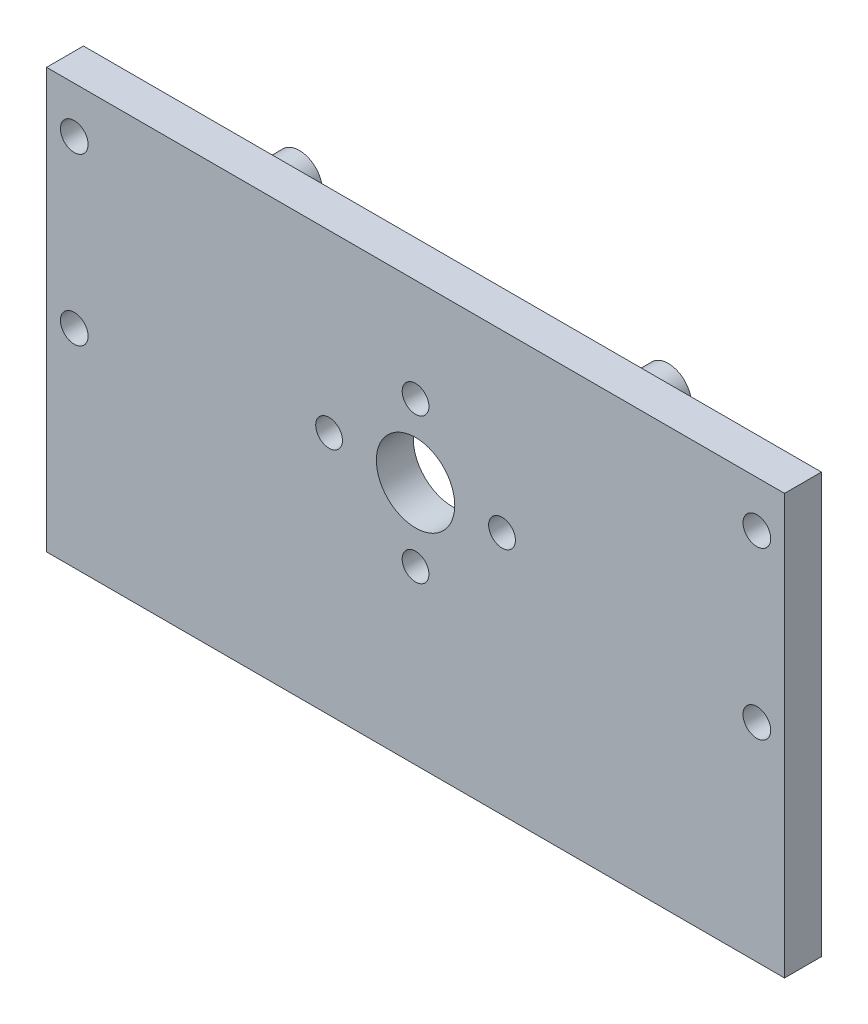
ISO-10303-21;
HEADER;
FILE_DESCRIPTION(('STEP AP214'),'2;1');
FILE_NAME('part.step','',(''),(''),'','','');
FILE_SCHEMA(('AUTOMOTIVE_DESIGN { 1 0 10303 214 1 1 1 1 }'));
ENDSEC;
DATA;
#1=APPLICATION_CONTEXT('core data for automotive mechanical design processes');
#2=APPLICATION_PROTOCOL_DEFINITION('international standard','automotive_design',2000,#1);
#3=PRODUCT_CONTEXT('',#1,'mechanical');
#4=PRODUCT('Part','Part','',(#3));
#5=PRODUCT_RELATED_PRODUCT_CATEGORY('part','',(#4));
#6=PRODUCT_DEFINITION_FORMATION('','',#4);
#7=PRODUCT_DEFINITION_CONTEXT('part definition',#1,'design');
#8=PRODUCT_DEFINITION('design','',#6,#7);
#9=PRODUCT_DEFINITION_SHAPE('','',#8);
#10=(LENGTH_UNIT() NAMED_UNIT(*) SI_UNIT(.MILLI.,.METRE.));
#11=(NAMED_UNIT(*) PLANE_ANGLE_UNIT() SI_UNIT($,.RADIAN.));
#12=(NAMED_UNIT(*) SI_UNIT($,.STERADIAN.) SOLID_ANGLE_UNIT());
#13=UNCERTAINTY_MEASURE_WITH_UNIT(LENGTH_MEASURE(1.E-05),#10,'distance_accuracy_value','');
#14=(GEOMETRIC_REPRESENTATION_CONTEXT(3) GLOBAL_UNCERTAINTY_ASSIGNED_CONTEXT((#13)) GLOBAL_UNIT_ASSIGNED_CONTEXT((#10,
#11,#12)) REPRESENTATION_CONTEXT('',''));
#15=CARTESIAN_POINT('',(0.,0.,0.));
#16=DIRECTION('',(0.,0.,1.));
#17=DIRECTION('',(1.,0.,0.));
#18=AXIS2_PLACEMENT_3D('',#15,#16,#17);
#19=CARTESIAN_POINT('',(40.,0.,-1.));
#20=DIRECTION('',(-1.,0.,0.));
#21=DIRECTION('',(0.,-1.,0.));
#22=AXIS2_PLACEMENT_3D('',#19,#20,#21);
#23=PLANE('',#22);
#24=DIRECTION('',(0.,0.,1.));
#25=VECTOR('',#24,1.);
#26=CARTESIAN_POINT('',(40.,22.75,-1.));
#27=LINE('',#26,#25);
#28=CARTESIAN_POINT('',(40.,22.75,-1.));
#29=VERTEX_POINT('',#28);
#30=CARTESIAN_POINT('',(40.,22.75,3.));
#31=VERTEX_POINT('',#30);
#32=EDGE_CURVE('E220',#29,#31,#27,.T.);
#33=ORIENTED_EDGE('',*,*,#32,.T.);
#34=DIRECTION('',(0.,-1.,0.));
#35=VECTOR('',#34,1.);
#36=CARTESIAN_POINT('',(40.,0.,3.));
#37=LINE('',#36,#35);
#38=CARTESIAN_POINT('',(40.,-22.75,3.));
#39=VERTEX_POINT('',#38);
#40=EDGE_CURVE('E181',#31,#39,#37,.T.);
#41=ORIENTED_EDGE('',*,*,#40,.T.);
#42=DIRECTION('',(0.,0.,1.));
#43=VECTOR('',#42,1.);
#44=CARTESIAN_POINT('',(40.,-22.75,-1.));
#45=LINE('',#44,#43);
#46=CARTESIAN_POINT('',(40.,-22.75,-1.));
#47=VERTEX_POINT('',#46);
#48=EDGE_CURVE('E222',#47,#39,#45,.T.);
#49=ORIENTED_EDGE('',*,*,#48,.F.);
#50=DIRECTION('',(0.,-1.,0.));
#51=VECTOR('',#50,1.);
#52=CARTESIAN_POINT('',(40.,0.,-1.));
#53=LINE('',#52,#51);
#54=EDGE_CURVE('E208',#29,#47,#53,.T.);
#55=ORIENTED_EDGE('',*,*,#54,.F.);
#56=EDGE_LOOP('',(#33,#41,#49,#55));
#57=FACE_BOUND('',#56,.T.);
#58=ADVANCED_FACE('F41',(#57),#23,.F.);
#59=CARTESIAN_POINT('',(0.,-22.75,-1.));
#60=DIRECTION('',(0.,-1.,0.));
#61=DIRECTION('',(0.,0.,-1.));
#62=AXIS2_PLACEMENT_3D('',#59,#60,#61);
#63=PLANE('',#62);
#64=ORIENTED_EDGE('',*,*,#48,.T.);
#65=DIRECTION('',(1.,0.,0.));
#66=VECTOR('',#65,1.);
#67=CARTESIAN_POINT('',(0.,-22.75,3.));
#68=LINE('',#67,#66);
#69=CARTESIAN_POINT('',(-40.,-22.75,3.));
#70=VERTEX_POINT('',#69);
#71=EDGE_CURVE('E190',#70,#39,#68,.T.);
#72=ORIENTED_EDGE('',*,*,#71,.F.);
#73=DIRECTION('',(0.,0.,1.));
#74=VECTOR('',#73,1.);
#75=CARTESIAN_POINT('',(-40.,-22.75,-1.));
#76=LINE('',#75,#74);
#77=CARTESIAN_POINT('',(-40.,-22.75,-1.));
#78=VERTEX_POINT('',#77);
#79=EDGE_CURVE('E225',#78,#70,#76,.T.);
#80=ORIENTED_EDGE('',*,*,#79,.F.);
#81=DIRECTION('',(1.,0.,0.));
#82=VECTOR('',#81,1.);
#83=CARTESIAN_POINT('',(0.,-22.75,-1.));
#84=LINE('',#83,#82);
#85=CARTESIAN_POINT('',(-20.,-22.75,-1.));
#86=VERTEX_POINT('',#85);
#87=EDGE_CURVE('E217',#78,#86,#84,.T.);
#88=ORIENTED_EDGE('',*,*,#87,.T.);
#89=CARTESIAN_POINT('',(20.,-22.75,-1.));
#90=VERTEX_POINT('',#89);
#91=EDGE_CURVE('E221',#86,#90,#84,.T.);
#92=ORIENTED_EDGE('',*,*,#91,.T.);
#93=EDGE_CURVE('E216',#90,#47,#84,.T.);
#94=ORIENTED_EDGE('',*,*,#93,.T.);
#95=EDGE_LOOP('',(#64,#72,#80,#88,#92,#94));
#96=FACE_BOUND('',#95,.T.);
#97=ADVANCED_FACE('F319',(#96),#63,.T.);
#98=CARTESIAN_POINT('',(-40.,0.,-1.));
#99=DIRECTION('',(-1.,0.,0.));
#100=DIRECTION('',(0.,0.,1.));
#101=AXIS2_PLACEMENT_3D('',#98,#99,#100);
#102=PLANE('',#101);
#103=ORIENTED_EDGE('',*,*,#79,.T.);
#104=DIRECTION('',(0.,-1.,0.));
#105=VECTOR('',#104,1.);
#106=CARTESIAN_POINT('',(-40.,0.,3.));
#107=LINE('',#106,#105);
#108=CARTESIAN_POINT('',(-40.,22.75,3.));
#109=VERTEX_POINT('',#108);
#110=EDGE_CURVE('E187',#109,#70,#107,.T.);
#111=ORIENTED_EDGE('',*,*,#110,.F.);
#112=DIRECTION('',(0.,0.,1.));
#113=VECTOR('',#112,1.);
#114=CARTESIAN_POINT('',(-40.,22.75,-1.));
#115=LINE('',#114,#113);
#116=CARTESIAN_POINT('',(-40.,22.75,-1.));
#117=VERTEX_POINT('',#116);
#118=EDGE_CURVE('E227',#117,#109,#115,.T.);
#119=ORIENTED_EDGE('',*,*,#118,.F.);
#120=DIRECTION('',(0.,-1.,0.));
#121=VECTOR('',#120,1.);
#122=CARTESIAN_POINT('',(-40.,0.,-1.));
#123=LINE('',#122,#121);
#124=EDGE_CURVE('E213',#117,#78,#123,.T.);
#125=ORIENTED_EDGE('',*,*,#124,.T.);
#126=EDGE_LOOP('',(#103,#111,#119,#125));
#127=FACE_BOUND('',#126,.T.);
#128=ADVANCED_FACE('F325',(#127),#102,.T.);
#129=CARTESIAN_POINT('',(0.,3.75,-1.));
#130=DIRECTION('',(0.,0.,1.));
#131=DIRECTION('',(1.,0.,0.));
#132=AXIS2_PLACEMENT_3D('',#129,#130,#131);
#133=CYLINDRICAL_SURFACE('',#132,4.25);
#134=CARTESIAN_POINT('',(0.,3.75,-1.));
#135=DIRECTION('',(0.,0.,1.));
#136=DIRECTION('',(1.,0.,0.));
#137=AXIS2_PLACEMENT_3D('',#134,#135,#136);
#138=CIRCLE('',#137,4.25);
#139=CARTESIAN_POINT('',(4.25,3.75,-1.));
#140=VERTEX_POINT('',#139);
#141=EDGE_CURVE('E205',#140,#140,#138,.T.);
#142=ORIENTED_EDGE('',*,*,#141,.F.);
#143=EDGE_LOOP('',(#142));
#144=FACE_BOUND('',#143,.T.);
#145=CARTESIAN_POINT('',(0.,3.75,3.));
#146=DIRECTION('',(0.,0.,1.));
#147=DIRECTION('',(1.,0.,0.));
#148=AXIS2_PLACEMENT_3D('',#145,#146,#147);
#149=CIRCLE('',#148,4.25);
#150=CARTESIAN_POINT('',(4.25,3.75,3.));
#151=VERTEX_POINT('',#150);
#152=EDGE_CURVE('E178',#151,#151,#149,.T.);
#153=ORIENTED_EDGE('',*,*,#152,.T.);
#154=EDGE_LOOP('',(#153));
#155=FACE_BOUND('',#154,.T.);
#156=ADVANCED_FACE('F357',(#144,#155),#133,.F.);
#157=CARTESIAN_POINT('',(37.,17.75,-1.));
#158=DIRECTION('',(0.,0.,1.));
#159=DIRECTION('',(1.,0.,0.));
#160=AXIS2_PLACEMENT_3D('',#157,#158,#159);
#161=CYLINDRICAL_SURFACE('',#160,1.5);
#162=CARTESIAN_POINT('',(37.,17.75,-1.));
#163=DIRECTION('',(0.,0.,1.));
#164=DIRECTION('',(1.,0.,0.));
#165=AXIS2_PLACEMENT_3D('',#162,#163,#164);
#166=CIRCLE('',#165,1.5);
#167=CARTESIAN_POINT('',(38.5,17.75,-1.));
#168=VERTEX_POINT('',#167);
#169=EDGE_CURVE('E202',#168,#168,#166,.T.);
#170=ORIENTED_EDGE('',*,*,#169,.F.);
#171=EDGE_LOOP('',(#170));
#172=FACE_BOUND('',#171,.T.);
#173=CARTESIAN_POINT('',(37.,17.75,3.));
#174=DIRECTION('',(0.,0.,1.));
#175=DIRECTION('',(1.,0.,0.));
#176=AXIS2_PLACEMENT_3D('',#173,#174,#175);
#177=CIRCLE('',#176,1.5);
#178=CARTESIAN_POINT('',(38.5,17.75,3.));
#179=VERTEX_POINT('',#178);
#180=EDGE_CURVE('E175',#179,#179,#177,.T.);
#181=ORIENTED_EDGE('',*,*,#180,.T.);
#182=EDGE_LOOP('',(#181));
#183=FACE_BOUND('',#182,.T.);
#184=ADVANCED_FACE('F360',(#172,#183),#161,.F.);
#185=CARTESIAN_POINT('',(37.,-0.25,-1.));
#186=DIRECTION('',(0.,0.,1.));
#187=DIRECTION('',(1.,0.,0.));
#188=AXIS2_PLACEMENT_3D('',#185,#186,#187);
#189=CYLINDRICAL_SURFACE('',#188,1.5);
#190=CARTESIAN_POINT('',(37.,-0.25,-1.));
#191=DIRECTION('',(0.,0.,1.));
#192=DIRECTION('',(1.,0.,0.));
#193=AXIS2_PLACEMENT_3D('',#190,#191,#192);
#194=CIRCLE('',#193,1.5);
#195=CARTESIAN_POINT('',(38.5,-0.25,-1.));
#196=VERTEX_POINT('',#195);
#197=EDGE_CURVE('E199',#196,#196,#194,.T.);
#198=ORIENTED_EDGE('',*,*,#197,.F.);
#199=EDGE_LOOP('',(#198));
#200=FACE_BOUND('',#199,.T.);
#201=CARTESIAN_POINT('',(37.,-0.25,3.));
#202=DIRECTION('',(0.,0.,1.));
#203=DIRECTION('',(1.,0.,0.));
#204=AXIS2_PLACEMENT_3D('',#201,#202,#203);
#205=CIRCLE('',#204,1.5);
#206=CARTESIAN_POINT('',(38.5,-0.25,3.));
#207=VERTEX_POINT('',#206);
#208=EDGE_CURVE('E172',#207,#207,#205,.T.);
#209=ORIENTED_EDGE('',*,*,#208,.T.);
#210=EDGE_LOOP('',(#209));
#211=FACE_BOUND('',#210,.T.);
#212=ADVANCED_FACE('F364',(#200,#211),#189,.F.);
#213=CARTESIAN_POINT('',(-37.,-0.25,-1.));
#214=DIRECTION('',(0.,0.,1.));
#215=DIRECTION('',(1.,0.,0.));
#216=AXIS2_PLACEMENT_3D('',#213,#214,#215);
#217=CYLINDRICAL_SURFACE('',#216,1.5);
#218=CARTESIAN_POINT('',(-37.,-0.25,-1.));
#219=DIRECTION('',(0.,0.,1.));
#220=DIRECTION('',(1.,0.,0.));
#221=AXIS2_PLACEMENT_3D('',#218,#219,#220);
#222=CIRCLE('',#221,1.5);
#223=CARTESIAN_POINT('',(-35.5,-0.25,-1.));
#224=VERTEX_POINT('',#223);
#225=EDGE_CURVE('E196',#224,#224,#222,.T.);
#226=ORIENTED_EDGE('',*,*,#225,.F.);
#227=EDGE_LOOP('',(#226));
#228=FACE_BOUND('',#227,.T.);
#229=CARTESIAN_POINT('',(-37.,-0.25,3.));
#230=DIRECTION('',(0.,0.,1.));
#231=DIRECTION('',(1.,0.,0.));
#232=AXIS2_PLACEMENT_3D('',#229,#230,#231);
#233=CIRCLE('',#232,1.5);
#234=CARTESIAN_POINT('',(-35.5,-0.25,3.));
#235=VERTEX_POINT('',#234);
#236=EDGE_CURVE('E169',#235,#235,#233,.T.);
#237=ORIENTED_EDGE('',*,*,#236,.T.);
#238=EDGE_LOOP('',(#237));
#239=FACE_BOUND('',#238,.T.);
#240=ADVANCED_FACE('F368',(#228,#239),#217,.F.);
#241=CARTESIAN_POINT('',(-37.,17.75,-1.));
#242=DIRECTION('',(0.,0.,1.));
#243=DIRECTION('',(1.,0.,0.));
#244=AXIS2_PLACEMENT_3D('',#241,#242,#243);
#245=CYLINDRICAL_SURFACE('',#244,1.5);
#246=CARTESIAN_POINT('',(-37.,17.75,-1.));
#247=DIRECTION('',(0.,0.,1.));
#248=DIRECTION('',(1.,0.,0.));
#249=AXIS2_PLACEMENT_3D('',#246,#247,#248);
#250=CIRCLE('',#249,1.5);
#251=CARTESIAN_POINT('',(-35.5,17.75,-1.));
#252=VERTEX_POINT('',#251);
#253=EDGE_CURVE('E193',#252,#252,#250,.T.);
#254=ORIENTED_EDGE('',*,*,#253,.F.);
#255=EDGE_LOOP('',(#254));
#256=FACE_BOUND('',#255,.T.);
#257=CARTESIAN_POINT('',(-37.,17.75,3.));
#258=DIRECTION('',(0.,0.,1.));
#259=DIRECTION('',(1.,0.,0.));
#260=AXIS2_PLACEMENT_3D('',#257,#258,#259);
#261=CIRCLE('',#260,1.5);
#262=CARTESIAN_POINT('',(-35.5,17.75,3.));
#263=VERTEX_POINT('',#262);
#264=EDGE_CURVE('E166',#263,#263,#261,.T.);
#265=ORIENTED_EDGE('',*,*,#264,.T.);
#266=EDGE_LOOP('',(#265));
#267=FACE_BOUND('',#266,.T.);
#268=ADVANCED_FACE('F372',(#256,#267),#245,.F.);
#269=CARTESIAN_POINT('',(0.,22.75,-1.));
#270=DIRECTION('',(0.,-1.,0.));
#271=DIRECTION('',(0.,0.,-1.));
#272=AXIS2_PLACEMENT_3D('',#269,#270,#271);
#273=PLANE('',#272);
#274=ORIENTED_EDGE('',*,*,#118,.T.);
#275=DIRECTION('',(1.,0.,0.));
#276=VECTOR('',#275,1.);
#277=CARTESIAN_POINT('',(0.,22.75,3.));
#278=LINE('',#277,#276);
#279=EDGE_CURVE('E184',#109,#31,#278,.T.);
#280=ORIENTED_EDGE('',*,*,#279,.T.);
#281=ORIENTED_EDGE('',*,*,#32,.F.);
#282=DIRECTION('',(1.,0.,0.));
#283=VECTOR('',#282,1.);
#284=CARTESIAN_POINT('',(0.,22.75,-1.));
#285=LINE('',#284,#283);
#286=EDGE_CURVE('E211',#117,#29,#285,.T.);
#287=ORIENTED_EDGE('',*,*,#286,.F.);
#288=EDGE_LOOP('',(#274,#280,#281,#287));
#289=FACE_BOUND('',#288,.T.);
#290=ADVANCED_FACE('F278',(#289),#273,.F.);
#291=CARTESIAN_POINT('',(0.,0.,-1.));
#292=DIRECTION('',(0.,0.,1.));
#293=DIRECTION('',(1.,0.,0.));
#294=AXIS2_PLACEMENT_3D('',#291,#292,#293);
#295=PLANE('',#294);
#296=CARTESIAN_POINT('',(-20.,18.75,-1.));
#297=DIRECTION('',(0.,0.,1.));
#298=DIRECTION('',(1.,0.,0.));
#299=AXIS2_PLACEMENT_3D('',#296,#297,#298);
#300=CIRCLE('',#299,3.5);
#301=CARTESIAN_POINT('',(-16.5,18.75,-1.));
#302=VERTEX_POINT('',#301);
#303=EDGE_CURVE('E252',#302,#302,#300,.T.);
#304=ORIENTED_EDGE('',*,*,#303,.T.);
#305=EDGE_LOOP('',(#304));
#306=FACE_BOUND('',#305,.T.);
#307=CARTESIAN_POINT('',(20.,18.75,-1.));
#308=DIRECTION('',(0.,0.,1.));
#309=DIRECTION('',(1.,0.,0.));
#310=AXIS2_PLACEMENT_3D('',#307,#308,#309);
#311=CIRCLE('',#310,3.5);
#312=CARTESIAN_POINT('',(23.5,18.75,-1.));
#313=VERTEX_POINT('',#312);
#314=EDGE_CURVE('E249',#313,#313,#311,.T.);
#315=ORIENTED_EDGE('',*,*,#314,.T.);
#316=EDGE_LOOP('',(#315));
#317=FACE_BOUND('',#316,.T.);
#318=CARTESIAN_POINT('',(0.,-4.125,-1.));
#319=DIRECTION('',(0.,0.,-1.));
#320=DIRECTION('',(-1.,0.,0.));
#321=AXIS2_PLACEMENT_3D('',#318,#319,#320);
#322=CIRCLE('',#321,1.45);
#323=CARTESIAN_POINT('',(-1.45,-4.125,-1.));
#324=VERTEX_POINT('',#323);
#325=EDGE_CURVE('E287',#324,#324,#322,.T.);
#326=ORIENTED_EDGE('',*,*,#325,.F.);
#327=EDGE_LOOP('',(#326));
#328=FACE_BOUND('',#327,.T.);
#329=CARTESIAN_POINT('',(9.375,3.75,-1.));
#330=DIRECTION('',(0.,0.,-1.));
#331=DIRECTION('',(-1.,0.,0.));
#332=AXIS2_PLACEMENT_3D('',#329,#330,#331);
#333=CIRCLE('',#332,1.45);
#334=CARTESIAN_POINT('',(7.925,3.75,-1.));
#335=VERTEX_POINT('',#334);
#336=EDGE_CURVE('E291',#335,#335,#333,.T.);
#337=ORIENTED_EDGE('',*,*,#336,.F.);
#338=EDGE_LOOP('',(#337));
#339=FACE_BOUND('',#338,.T.);
#340=CARTESIAN_POINT('',(0.,11.625,-1.));
#341=DIRECTION('',(0.,0.,-1.));
#342=DIRECTION('',(-1.,0.,0.));
#343=AXIS2_PLACEMENT_3D('',#340,#341,#342);
#344=CIRCLE('',#343,1.45);
#345=CARTESIAN_POINT('',(-1.45,11.625,-1.));
#346=VERTEX_POINT('',#345);
#347=EDGE_CURVE('E295',#346,#346,#344,.T.);
#348=ORIENTED_EDGE('',*,*,#347,.F.);
#349=EDGE_LOOP('',(#348));
#350=FACE_BOUND('',#349,.T.);
#351=CARTESIAN_POINT('',(-9.375,3.75,-1.));
#352=DIRECTION('',(0.,0.,-1.));
#353=DIRECTION('',(-1.,0.,0.));
#354=AXIS2_PLACEMENT_3D('',#351,#352,#353);
#355=CIRCLE('',#354,1.45);
#356=CARTESIAN_POINT('',(-10.825,3.75,-1.));
#357=VERTEX_POINT('',#356);
#358=EDGE_CURVE('E299',#357,#357,#355,.T.);
#359=ORIENTED_EDGE('',*,*,#358,.F.);
#360=EDGE_LOOP('',(#359));
#361=FACE_BOUND('',#360,.T.);
#362=DIRECTION('',(0.,-1.,0.));
#363=VECTOR('',#362,1.);
#364=CARTESIAN_POINT('',(18.5940650356822,0.,-1.));
#365=LINE('',#364,#363);
#366=CARTESIAN_POINT('',(18.5940650356822,-7.69525703388013,-1.));
#367=VERTEX_POINT('',#366);
#368=CARTESIAN_POINT('',(18.5940650356822,-11.6952570338801,-1.));
#369=VERTEX_POINT('',#368);
#370=EDGE_CURVE('E242',#367,#369,#365,.T.);
#371=ORIENTED_EDGE('',*,*,#370,.F.);
#372=DIRECTION('',(-1.,0.,0.));
#373=VECTOR('',#372,1.);
#374=CARTESIAN_POINT('',(0.,-7.69525703388013,-1.));
#375=LINE('',#374,#373);
#376=CARTESIAN_POINT('',(-18.6059349643178,-7.69525703388013,-1.));
#377=VERTEX_POINT('',#376);
#378=EDGE_CURVE('E244',#367,#377,#375,.T.);
#379=ORIENTED_EDGE('',*,*,#378,.T.);
#380=DIRECTION('',(0.,-1.,0.));
#381=VECTOR('',#380,1.);
#382=CARTESIAN_POINT('',(-18.6059349643178,0.,-1.));
#383=LINE('',#382,#381);
#384=CARTESIAN_POINT('',(-18.6059349643178,-11.6952570338801,-1.));
#385=VERTEX_POINT('',#384);
#386=EDGE_CURVE('E115',#377,#385,#383,.T.);
#387=ORIENTED_EDGE('',*,*,#386,.T.);
#388=DIRECTION('',(-1.,0.,0.));
#389=VECTOR('',#388,1.);
#390=CARTESIAN_POINT('',(0.,-11.6952570338801,-1.));
#391=LINE('',#390,#389);
#392=EDGE_CURVE('E239',#369,#385,#391,.T.);
#393=ORIENTED_EDGE('',*,*,#392,.F.);
#394=EDGE_LOOP('',(#371,#379,#387,#393));
#395=FACE_BOUND('',#394,.T.);
#396=ORIENTED_EDGE('',*,*,#253,.T.);
#397=EDGE_LOOP('',(#396));
#398=FACE_BOUND('',#397,.T.);
#399=ORIENTED_EDGE('',*,*,#225,.T.);
#400=EDGE_LOOP('',(#399));
#401=FACE_BOUND('',#400,.T.);
#402=ORIENTED_EDGE('',*,*,#197,.T.);
#403=EDGE_LOOP('',(#402));
#404=FACE_BOUND('',#403,.T.);
#405=ORIENTED_EDGE('',*,*,#169,.T.);
#406=EDGE_LOOP('',(#405));
#407=FACE_BOUND('',#406,.T.);
#408=ORIENTED_EDGE('',*,*,#141,.T.);
#409=EDGE_LOOP('',(#408));
#410=FACE_BOUND('',#409,.T.);
#411=ORIENTED_EDGE('',*,*,#93,.F.);
#412=CARTESIAN_POINT('',(20.,-19.25,-1.));
#413=DIRECTION('',(0.,0.,1.));
#414=DIRECTION('',(1.,0.,0.));
#415=AXIS2_PLACEMENT_3D('',#412,#413,#414);
#416=CIRCLE('',#415,3.5);
#417=EDGE_CURVE('E54',#90,#90,#416,.T.);
#418=ORIENTED_EDGE('',*,*,#417,.T.);
#419=ORIENTED_EDGE('',*,*,#91,.F.);
#420=CARTESIAN_POINT('',(-20.,-19.25,-1.));
#421=DIRECTION('',(0.,0.,1.));
#422=DIRECTION('',(1.,0.,0.));
#423=AXIS2_PLACEMENT_3D('',#420,#421,#422);
#424=CIRCLE('',#423,3.5);
#425=EDGE_CURVE('E59',#86,#86,#424,.T.);
#426=ORIENTED_EDGE('',*,*,#425,.T.);
#427=ORIENTED_EDGE('',*,*,#87,.F.);
#428=ORIENTED_EDGE('',*,*,#124,.F.);
#429=ORIENTED_EDGE('',*,*,#286,.T.);
#430=ORIENTED_EDGE('',*,*,#54,.T.);
#431=EDGE_LOOP('',(#411,#418,#419,#426,#427,#428,#429,#430));
#432=FACE_BOUND('',#431,.T.);
#433=ADVANCED_FACE('F274',(#306,#317,#328,#339,#350,#361,#395,#398,#401,#404,#407,#410,#432),
#295,.F.);
#434=CARTESIAN_POINT('',(0.,0.,3.));
#435=DIRECTION('',(0.,0.,1.));
#436=DIRECTION('',(1.,0.,0.));
#437=AXIS2_PLACEMENT_3D('',#434,#435,#436);
#438=PLANE('',#437);
#439=CARTESIAN_POINT('',(0.,-4.125,3.));
#440=DIRECTION('',(0.,0.,-1.));
#441=DIRECTION('',(-1.,0.,0.));
#442=AXIS2_PLACEMENT_3D('',#439,#440,#441);
#443=CIRCLE('',#442,1.45);
#444=CARTESIAN_POINT('',(-1.45,-4.125,3.));
#445=VERTEX_POINT('',#444);
#446=EDGE_CURVE('E718',#445,#445,#443,.T.);
#447=ORIENTED_EDGE('',*,*,#446,.T.);
#448=EDGE_LOOP('',(#447));
#449=FACE_BOUND('',#448,.T.);
#450=CARTESIAN_POINT('',(9.375,3.75,3.));
#451=DIRECTION('',(0.,0.,-1.));
#452=DIRECTION('',(-1.,0.,0.));
#453=AXIS2_PLACEMENT_3D('',#450,#451,#452);
#454=CIRCLE('',#453,1.45);
#455=CARTESIAN_POINT('',(7.925,3.75,3.));
#456=VERTEX_POINT('',#455);
#457=EDGE_CURVE('E729',#456,#456,#454,.T.);
#458=ORIENTED_EDGE('',*,*,#457,.T.);
#459=EDGE_LOOP('',(#458));
#460=FACE_BOUND('',#459,.T.);
#461=CARTESIAN_POINT('',(0.,11.625,3.));
#462=DIRECTION('',(0.,0.,-1.));
#463=DIRECTION('',(-1.,0.,0.));
#464=AXIS2_PLACEMENT_3D('',#461,#462,#463);
#465=CIRCLE('',#464,1.45);
#466=CARTESIAN_POINT('',(-1.45,11.625,3.));
#467=VERTEX_POINT('',#466);
#468=EDGE_CURVE('E725',#467,#467,#465,.T.);
#469=ORIENTED_EDGE('',*,*,#468,.T.);
#470=EDGE_LOOP('',(#469));
#471=FACE_BOUND('',#470,.T.);
#472=CARTESIAN_POINT('',(-9.375,3.75,3.));
#473=DIRECTION('',(0.,0.,-1.));
#474=DIRECTION('',(-1.,0.,0.));
#475=AXIS2_PLACEMENT_3D('',#472,#473,#474);
#476=CIRCLE('',#475,1.45);
#477=CARTESIAN_POINT('',(-10.825,3.75,3.));
#478=VERTEX_POINT('',#477);
#479=EDGE_CURVE('E721',#478,#478,#476,.T.);
#480=ORIENTED_EDGE('',*,*,#479,.T.);
#481=EDGE_LOOP('',(#480));
#482=FACE_BOUND('',#481,.T.);
#483=ORIENTED_EDGE('',*,*,#264,.F.);
#484=EDGE_LOOP('',(#483));
#485=FACE_BOUND('',#484,.T.);
#486=ORIENTED_EDGE('',*,*,#236,.F.);
#487=EDGE_LOOP('',(#486));
#488=FACE_BOUND('',#487,.T.);
#489=ORIENTED_EDGE('',*,*,#208,.F.);
#490=EDGE_LOOP('',(#489));
#491=FACE_BOUND('',#490,.T.);
#492=ORIENTED_EDGE('',*,*,#180,.F.);
#493=EDGE_LOOP('',(#492));
#494=FACE_BOUND('',#493,.T.);
#495=ORIENTED_EDGE('',*,*,#152,.F.);
#496=EDGE_LOOP('',(#495));
#497=FACE_BOUND('',#496,.T.);
#498=ORIENTED_EDGE('',*,*,#40,.F.);
#499=ORIENTED_EDGE('',*,*,#279,.F.);
#500=ORIENTED_EDGE('',*,*,#110,.T.);
#501=ORIENTED_EDGE('',*,*,#71,.T.);
#502=EDGE_LOOP('',(#498,#499,#500,#501));
#503=FACE_BOUND('',#502,.T.);
#504=ADVANCED_FACE('F277',(#449,#460,#471,#482,#485,#488,#491,#494,#497,#503),#438,.T.);
#505=CARTESIAN_POINT('',(20.,18.75,-4.4));
#506=DIRECTION('',(0.,0.,1.));
#507=DIRECTION('',(1.,0.,0.));
#508=AXIS2_PLACEMENT_3D('',#505,#506,#507);
#509=CYLINDRICAL_SURFACE('',#508,1.4);
#510=CARTESIAN_POINT('',(20.,18.75,-4.4));
#511=DIRECTION('',(0.,0.,1.));
#512=DIRECTION('',(1.,0.,0.));
#513=AXIS2_PLACEMENT_3D('',#510,#511,#512);
#514=CIRCLE('',#513,1.4);
#515=CARTESIAN_POINT('',(21.4,18.75,-4.4));
#516=VERTEX_POINT('',#515);
#517=EDGE_CURVE('E160',#516,#516,#514,.T.);
#518=ORIENTED_EDGE('',*,*,#517,.F.);
#519=EDGE_LOOP('',(#518));
#520=FACE_BOUND('',#519,.T.);
#521=CARTESIAN_POINT('',(20.,18.75,-1.));
#522=DIRECTION('',(0.,0.,1.));
#523=DIRECTION('',(1.,0.,0.));
#524=AXIS2_PLACEMENT_3D('',#521,#522,#523);
#525=CIRCLE('',#524,1.4);
#526=CARTESIAN_POINT('',(21.4,18.75,-1.));
#527=VERTEX_POINT('',#526);
#528=EDGE_CURVE('E224',#527,#527,#525,.T.);
#529=ORIENTED_EDGE('',*,*,#528,.T.);
#530=EDGE_LOOP('',(#529));
#531=FACE_BOUND('',#530,.T.);
#532=ADVANCED_FACE('F334',(#520,#531),#509,.F.);
#533=CARTESIAN_POINT('',(20.,18.75,-4.4));
#534=DIRECTION('',(0.,0.,1.));
#535=DIRECTION('',(1.,0.,0.));
#536=AXIS2_PLACEMENT_3D('',#533,#534,#535);
#537=CYLINDRICAL_SURFACE('',#536,2.5);
#538=CARTESIAN_POINT('',(20.,18.75,-2.));
#539=DIRECTION('',(0.,0.,1.));
#540=DIRECTION('',(1.,0.,0.));
#541=AXIS2_PLACEMENT_3D('',#538,#539,#540);
#542=CIRCLE('',#541,2.5);
#543=CARTESIAN_POINT('',(22.5,18.75,-2.));
#544=VERTEX_POINT('',#543);
#545=EDGE_CURVE('E11',#544,#544,#542,.F.);
#546=ORIENTED_EDGE('',*,*,#545,.T.);
#547=EDGE_LOOP('',(#546));
#548=FACE_BOUND('',#547,.T.);
#549=CARTESIAN_POINT('',(20.,18.75,-4.4));
#550=DIRECTION('',(0.,0.,1.));
#551=DIRECTION('',(1.,0.,0.));
#552=AXIS2_PLACEMENT_3D('',#549,#550,#551);
#553=CIRCLE('',#552,2.5);
#554=CARTESIAN_POINT('',(22.5,18.75,-4.4));
#555=VERTEX_POINT('',#554);
#556=EDGE_CURVE('E163',#555,#555,#553,.T.);
#557=ORIENTED_EDGE('',*,*,#556,.T.);
#558=EDGE_LOOP('',(#557));
#559=FACE_BOUND('',#558,.T.);
#560=ADVANCED_FACE('F342',(#548,#559),#537,.T.);
#561=CARTESIAN_POINT('',(0.,0.,-4.4));
#562=DIRECTION('',(0.,0.,1.));
#563=DIRECTION('',(1.,0.,0.));
#564=AXIS2_PLACEMENT_3D('',#561,#562,#563);
#565=PLANE('',#564);
#566=ORIENTED_EDGE('',*,*,#517,.T.);
#567=EDGE_LOOP('',(#566));
#568=FACE_BOUND('',#567,.T.);
#569=ORIENTED_EDGE('',*,*,#556,.F.);
#570=EDGE_LOOP('',(#569));
#571=FACE_BOUND('',#570,.T.);
#572=ADVANCED_FACE('F421',(#568,#571),#565,.F.);
#573=ORIENTED_EDGE('',*,*,#528,.F.);
#574=EDGE_LOOP('',(#573));
#575=FACE_BOUND('',#574,.T.);
#576=ADVANCED_FACE('F281',(#575),#295,.F.);
#577=CARTESIAN_POINT('',(-20.,18.75,-4.4));
#578=DIRECTION('',(0.,0.,1.));
#579=DIRECTION('',(1.,0.,0.));
#580=AXIS2_PLACEMENT_3D('',#577,#578,#579);
#581=CYLINDRICAL_SURFACE('',#580,1.4);
#582=CARTESIAN_POINT('',(-20.,18.75,-4.4));
#583=DIRECTION('',(0.,0.,1.));
#584=DIRECTION('',(1.,0.,0.));
#585=AXIS2_PLACEMENT_3D('',#582,#583,#584);
#586=CIRCLE('',#585,1.4);
#587=CARTESIAN_POINT('',(-18.6,18.75,-4.4));
#588=VERTEX_POINT('',#587);
#589=EDGE_CURVE('E154',#588,#588,#586,.T.);
#590=ORIENTED_EDGE('',*,*,#589,.F.);
#591=EDGE_LOOP('',(#590));
#592=FACE_BOUND('',#591,.T.);
#593=CARTESIAN_POINT('',(-20.,18.75,-1.));
#594=DIRECTION('',(0.,0.,1.));
#595=DIRECTION('',(1.,0.,0.));
#596=AXIS2_PLACEMENT_3D('',#593,#594,#595);
#597=CIRCLE('',#596,1.4);
#598=CARTESIAN_POINT('',(-18.6,18.75,-1.));
#599=VERTEX_POINT('',#598);
#600=EDGE_CURVE('E232',#599,#599,#597,.T.);
#601=ORIENTED_EDGE('',*,*,#600,.T.);
#602=EDGE_LOOP('',(#601));
#603=FACE_BOUND('',#602,.T.);
#604=ADVANCED_FACE('F417',(#592,#603),#581,.F.);
#605=CARTESIAN_POINT('',(-20.,18.75,-4.4));
#606=DIRECTION('',(0.,0.,1.));
#607=DIRECTION('',(1.,0.,0.));
#608=AXIS2_PLACEMENT_3D('',#605,#606,#607);
#609=CYLINDRICAL_SURFACE('',#608,2.5);
#610=CARTESIAN_POINT('',(-20.,18.75,-2.));
#611=DIRECTION('',(0.,0.,1.));
#612=DIRECTION('',(1.,0.,0.));
#613=AXIS2_PLACEMENT_3D('',#610,#611,#612);
#614=CIRCLE('',#613,2.5);
#615=CARTESIAN_POINT('',(-17.5,18.75,-2.));
#616=VERTEX_POINT('',#615);
#617=EDGE_CURVE('E49',#616,#616,#614,.F.);
#618=ORIENTED_EDGE('',*,*,#617,.T.);
#619=EDGE_LOOP('',(#618));
#620=FACE_BOUND('',#619,.T.);
#621=CARTESIAN_POINT('',(-20.,18.75,-4.4));
#622=DIRECTION('',(0.,0.,1.));
#623=DIRECTION('',(1.,0.,0.));
#624=AXIS2_PLACEMENT_3D('',#621,#622,#623);
#625=CIRCLE('',#624,2.5);
#626=CARTESIAN_POINT('',(-17.5,18.75,-4.4));
#627=VERTEX_POINT('',#626);
#628=EDGE_CURVE('E157',#627,#627,#625,.T.);
#629=ORIENTED_EDGE('',*,*,#628,.T.);
#630=EDGE_LOOP('',(#629));
#631=FACE_BOUND('',#630,.T.);
#632=ADVANCED_FACE('F265',(#620,#631),#609,.T.);
#633=CARTESIAN_POINT('',(0.,0.,-4.4));
#634=DIRECTION('',(0.,0.,1.));
#635=DIRECTION('',(1.,0.,0.));
#636=AXIS2_PLACEMENT_3D('',#633,#634,#635);
#637=PLANE('',#636);
#638=ORIENTED_EDGE('',*,*,#589,.T.);
#639=EDGE_LOOP('',(#638));
#640=FACE_BOUND('',#639,.T.);
#641=ORIENTED_EDGE('',*,*,#628,.F.);
#642=EDGE_LOOP('',(#641));
#643=FACE_BOUND('',#642,.T.);
#644=ADVANCED_FACE('F411',(#640,#643),#637,.F.);
#645=ORIENTED_EDGE('',*,*,#600,.F.);
#646=EDGE_LOOP('',(#645));
#647=FACE_BOUND('',#646,.T.);
#648=ADVANCED_FACE('F405',(#647),#295,.F.);
#649=CARTESIAN_POINT('',(-20.,-19.25,-4.4));
#650=DIRECTION('',(0.,0.,1.));
#651=DIRECTION('',(1.,0.,0.));
#652=AXIS2_PLACEMENT_3D('',#649,#650,#651);
#653=CYLINDRICAL_SURFACE('',#652,1.4);
#654=CARTESIAN_POINT('',(-20.,-19.25,-4.4));
#655=DIRECTION('',(0.,0.,1.));
#656=DIRECTION('',(1.,0.,0.));
#657=AXIS2_PLACEMENT_3D('',#654,#655,#656);
#658=CIRCLE('',#657,1.4);
#659=CARTESIAN_POINT('',(-18.6,-19.25,-4.4));
#660=VERTEX_POINT('',#659);
#661=EDGE_CURVE('E144',#660,#660,#658,.T.);
#662=ORIENTED_EDGE('',*,*,#661,.F.);
#663=EDGE_LOOP('',(#662));
#664=FACE_BOUND('',#663,.T.);
#665=CARTESIAN_POINT('',(-20.,-19.25,-1.));
#666=DIRECTION('',(0.,0.,1.));
#667=DIRECTION('',(1.,0.,0.));
#668=AXIS2_PLACEMENT_3D('',#665,#666,#667);
#669=CIRCLE('',#668,1.4);
#670=CARTESIAN_POINT('',(-18.6,-19.25,-1.));
#671=VERTEX_POINT('',#670);
#672=EDGE_CURVE('E235',#671,#671,#669,.T.);
#673=ORIENTED_EDGE('',*,*,#672,.T.);
#674=EDGE_LOOP('',(#673));
#675=FACE_BOUND('',#674,.T.);
#676=ADVANCED_FACE('F392',(#664,#675),#653,.F.);
#677=CARTESIAN_POINT('',(-20.,-19.25,-4.4));
#678=DIRECTION('',(0.,0.,1.));
#679=DIRECTION('',(1.,0.,0.));
#680=AXIS2_PLACEMENT_3D('',#677,#678,#679);
#681=CYLINDRICAL_SURFACE('',#680,2.5);
#682=CARTESIAN_POINT('',(-20.,-19.25,-2.));
#683=DIRECTION('',(0.,0.,1.));
#684=DIRECTION('',(1.,0.,0.));
#685=AXIS2_PLACEMENT_3D('',#682,#683,#684);
#686=CIRCLE('',#685,2.5);
#687=CARTESIAN_POINT('',(-17.5,-19.25,-2.));
#688=VERTEX_POINT('',#687);
#689=EDGE_CURVE('E260',#688,#688,#686,.F.);
#690=ORIENTED_EDGE('',*,*,#689,.T.);
#691=EDGE_LOOP('',(#690));
#692=FACE_BOUND('',#691,.T.);
#693=CARTESIAN_POINT('',(-20.,-19.25,-4.4));
#694=DIRECTION('',(0.,0.,1.));
#695=DIRECTION('',(1.,0.,0.));
#696=AXIS2_PLACEMENT_3D('',#693,#694,#695);
#697=CIRCLE('',#696,2.5);
#698=CARTESIAN_POINT('',(-17.5,-19.25,-4.4));
#699=VERTEX_POINT('',#698);
#700=EDGE_CURVE('E151',#699,#699,#697,.T.);
#701=ORIENTED_EDGE('',*,*,#700,.T.);
#702=EDGE_LOOP('',(#701));
#703=FACE_BOUND('',#702,.T.);
#704=ADVANCED_FACE('F388',(#692,#703),#681,.T.);
#705=CARTESIAN_POINT('',(0.,0.,-4.4));
#706=DIRECTION('',(0.,0.,1.));
#707=DIRECTION('',(1.,0.,0.));
#708=AXIS2_PLACEMENT_3D('',#705,#706,#707);
#709=PLANE('',#708);
#710=ORIENTED_EDGE('',*,*,#661,.T.);
#711=EDGE_LOOP('',(#710));
#712=FACE_BOUND('',#711,.T.);
#713=ORIENTED_EDGE('',*,*,#700,.F.);
#714=EDGE_LOOP('',(#713));
#715=FACE_BOUND('',#714,.T.);
#716=ADVANCED_FACE('F391',(#712,#715),#709,.F.);
#717=ORIENTED_EDGE('',*,*,#672,.F.);
#718=EDGE_LOOP('',(#717));
#719=FACE_BOUND('',#718,.T.);
#720=ADVANCED_FACE('F397',(#719),#295,.F.);
#721=CARTESIAN_POINT('',(0.,-7.69525703388013,-4.4));
#722=DIRECTION('',(0.,1.,0.));
#723=DIRECTION('',(-1.,0.,0.));
#724=AXIS2_PLACEMENT_3D('',#721,#722,#723);
#725=PLANE('',#724);
#726=ORIENTED_EDGE('',*,*,#378,.F.);
#727=DIRECTION('',(0.,0.,1.));
#728=VECTOR('',#727,1.);
#729=CARTESIAN_POINT('',(18.5940650356822,-7.69525703388013,-4.4));
#730=LINE('',#729,#728);
#731=CARTESIAN_POINT('',(18.5940650356822,-7.69525703388013,-4.4));
#732=VERTEX_POINT('',#731);
#733=EDGE_CURVE('E132',#732,#367,#730,.T.);
#734=ORIENTED_EDGE('',*,*,#733,.F.);
#735=DIRECTION('',(-1.,0.,0.));
#736=VECTOR('',#735,1.);
#737=CARTESIAN_POINT('',(0.,-7.69525703388013,-4.4));
#738=LINE('',#737,#736);
#739=CARTESIAN_POINT('',(-18.6059349643178,-7.69525703388013,-4.4));
#740=VERTEX_POINT('',#739);
#741=EDGE_CURVE('E125',#732,#740,#738,.T.);
#742=ORIENTED_EDGE('',*,*,#741,.T.);
#743=DIRECTION('',(0.,0.,1.));
#744=VECTOR('',#743,1.);
#745=CARTESIAN_POINT('',(-18.6059349643178,-7.69525703388013,-4.4));
#746=LINE('',#745,#744);
#747=EDGE_CURVE('E110',#740,#377,#746,.T.);
#748=ORIENTED_EDGE('',*,*,#747,.T.);
#749=EDGE_LOOP('',(#726,#734,#742,#748));
#750=FACE_BOUND('',#749,.T.);
#751=ADVANCED_FACE('F130',(#750),#725,.T.);
#752=CARTESIAN_POINT('',(18.5940650356822,0.,-4.4));
#753=DIRECTION('',(-1.,0.,0.));
#754=DIRECTION('',(0.,-1.,0.));
#755=AXIS2_PLACEMENT_3D('',#752,#753,#754);
#756=PLANE('',#755);
#757=ORIENTED_EDGE('',*,*,#733,.T.);
#758=ORIENTED_EDGE('',*,*,#370,.T.);
#759=DIRECTION('',(0.,0.,1.));
#760=VECTOR('',#759,1.);
#761=CARTESIAN_POINT('',(18.5940650356822,-11.6952570338801,-4.4));
#762=LINE('',#761,#760);
#763=CARTESIAN_POINT('',(18.5940650356822,-11.6952570338801,-4.4));
#764=VERTEX_POINT('',#763);
#765=EDGE_CURVE('E145',#764,#369,#762,.T.);
#766=ORIENTED_EDGE('',*,*,#765,.F.);
#767=DIRECTION('',(0.,-1.,0.));
#768=VECTOR('',#767,1.);
#769=CARTESIAN_POINT('',(18.5940650356822,0.,-4.4));
#770=LINE('',#769,#768);
#771=EDGE_CURVE('E120',#732,#764,#770,.T.);
#772=ORIENTED_EDGE('',*,*,#771,.F.);
#773=EDGE_LOOP('',(#757,#758,#766,#772));
#774=FACE_BOUND('',#773,.T.);
#775=ADVANCED_FACE('F547',(#774),#756,.F.);
#776=CARTESIAN_POINT('',(0.,-11.6952570338801,-4.4));
#777=DIRECTION('',(0.,1.,0.));
#778=DIRECTION('',(-1.,0.,0.));
#779=AXIS2_PLACEMENT_3D('',#776,#777,#778);
#780=PLANE('',#779);
#781=ORIENTED_EDGE('',*,*,#765,.T.);
#782=ORIENTED_EDGE('',*,*,#392,.T.);
#783=DIRECTION('',(0.,0.,1.));
#784=VECTOR('',#783,1.);
#785=CARTESIAN_POINT('',(-18.6059349643178,-11.6952570338801,-4.4));
#786=LINE('',#785,#784);
#787=CARTESIAN_POINT('',(-18.6059349643178,-11.6952570338801,-4.4));
#788=VERTEX_POINT('',#787);
#789=EDGE_CURVE('E119',#788,#385,#786,.T.);
#790=ORIENTED_EDGE('',*,*,#789,.F.);
#791=DIRECTION('',(-1.,0.,0.));
#792=VECTOR('',#791,1.);
#793=CARTESIAN_POINT('',(0.,-11.6952570338801,-4.4));
#794=LINE('',#793,#792);
#795=EDGE_CURVE('E127',#764,#788,#794,.T.);
#796=ORIENTED_EDGE('',*,*,#795,.F.);
#797=EDGE_LOOP('',(#781,#782,#790,#796));
#798=FACE_BOUND('',#797,.T.);
#799=ADVANCED_FACE('F539',(#798),#780,.F.);
#800=CARTESIAN_POINT('',(-18.6059349643178,0.,-4.4));
#801=DIRECTION('',(-1.,0.,0.));
#802=DIRECTION('',(0.,0.,1.));
#803=AXIS2_PLACEMENT_3D('',#800,#801,#802);
#804=PLANE('',#803);
#805=ORIENTED_EDGE('',*,*,#386,.F.);
#806=ORIENTED_EDGE('',*,*,#747,.F.);
#807=DIRECTION('',(0.,-1.,0.));
#808=VECTOR('',#807,1.);
#809=CARTESIAN_POINT('',(-18.6059349643178,0.,-4.4));
#810=LINE('',#809,#808);
#811=EDGE_CURVE('E113',#740,#788,#810,.T.);
#812=ORIENTED_EDGE('',*,*,#811,.T.);
#813=ORIENTED_EDGE('',*,*,#789,.T.);
#814=EDGE_LOOP('',(#805,#806,#812,#813));
#815=FACE_BOUND('',#814,.T.);
#816=ADVANCED_FACE('F112',(#815),#804,.T.);
#817=CARTESIAN_POINT('',(0.,0.,-4.4));
#818=DIRECTION('',(0.,0.,1.));
#819=DIRECTION('',(1.,0.,0.));
#820=AXIS2_PLACEMENT_3D('',#817,#818,#819);
#821=PLANE('',#820);
#822=ORIENTED_EDGE('',*,*,#741,.F.);
#823=ORIENTED_EDGE('',*,*,#771,.T.);
#824=ORIENTED_EDGE('',*,*,#795,.T.);
#825=ORIENTED_EDGE('',*,*,#811,.F.);
#826=EDGE_LOOP('',(#822,#823,#824,#825));
#827=FACE_BOUND('',#826,.T.);
#828=ADVANCED_FACE('F124',(#827),#821,.F.);
#829=CARTESIAN_POINT('',(20.,-19.25,-4.4));
#830=DIRECTION('',(0.,0.,1.));
#831=DIRECTION('',(1.,0.,0.));
#832=AXIS2_PLACEMENT_3D('',#829,#830,#831);
#833=CYLINDRICAL_SURFACE('',#832,1.4);
#834=CARTESIAN_POINT('',(20.,-19.25,-4.4));
#835=DIRECTION('',(0.,0.,1.));
#836=DIRECTION('',(1.,0.,0.));
#837=AXIS2_PLACEMENT_3D('',#834,#835,#836);
#838=CIRCLE('',#837,1.4);
#839=CARTESIAN_POINT('',(21.4,-19.25,-4.4));
#840=VERTEX_POINT('',#839);
#841=EDGE_CURVE('E137',#840,#840,#838,.T.);
#842=ORIENTED_EDGE('',*,*,#841,.F.);
#843=EDGE_LOOP('',(#842));
#844=FACE_BOUND('',#843,.T.);
#845=CARTESIAN_POINT('',(20.,-19.25,-1.));
#846=DIRECTION('',(0.,0.,1.));
#847=DIRECTION('',(1.,0.,0.));
#848=AXIS2_PLACEMENT_3D('',#845,#846,#847);
#849=CIRCLE('',#848,1.4);
#850=CARTESIAN_POINT('',(21.4,-19.25,-1.));
#851=VERTEX_POINT('',#850);
#852=EDGE_CURVE('E246',#851,#851,#849,.T.);
#853=ORIENTED_EDGE('',*,*,#852,.T.);
#854=EDGE_LOOP('',(#853));
#855=FACE_BOUND('',#854,.T.);
#856=ADVANCED_FACE('F513',(#844,#855),#833,.F.);
#857=CARTESIAN_POINT('',(20.,-19.25,-4.4));
#858=DIRECTION('',(0.,0.,1.));
#859=DIRECTION('',(1.,0.,0.));
#860=AXIS2_PLACEMENT_3D('',#857,#858,#859);
#861=CYLINDRICAL_SURFACE('',#860,2.5);
#862=CARTESIAN_POINT('',(20.,-19.25,-2.));
#863=DIRECTION('',(0.,0.,1.));
#864=DIRECTION('',(1.,0.,0.));
#865=AXIS2_PLACEMENT_3D('',#862,#863,#864);
#866=CIRCLE('',#865,2.5);
#867=CARTESIAN_POINT('',(22.5,-19.25,-2.));
#868=VERTEX_POINT('',#867);
#869=EDGE_CURVE('E257',#868,#868,#866,.F.);
#870=ORIENTED_EDGE('',*,*,#869,.T.);
#871=EDGE_LOOP('',(#870));
#872=FACE_BOUND('',#871,.T.);
#873=CARTESIAN_POINT('',(20.,-19.25,-4.4));
#874=DIRECTION('',(0.,0.,1.));
#875=DIRECTION('',(1.,0.,0.));
#876=AXIS2_PLACEMENT_3D('',#873,#874,#875);
#877=CIRCLE('',#876,2.5);
#878=CARTESIAN_POINT('',(22.5,-19.25,-4.4));
#879=VERTEX_POINT('',#878);
#880=EDGE_CURVE('E134',#879,#879,#877,.T.);
#881=ORIENTED_EDGE('',*,*,#880,.T.);
#882=EDGE_LOOP('',(#881));
#883=FACE_BOUND('',#882,.T.);
#884=ADVANCED_FACE('F503',(#872,#883),#861,.T.);
#885=CARTESIAN_POINT('',(0.,0.,-4.4));
#886=DIRECTION('',(0.,0.,1.));
#887=DIRECTION('',(1.,0.,0.));
#888=AXIS2_PLACEMENT_3D('',#885,#886,#887);
#889=PLANE('',#888);
#890=ORIENTED_EDGE('',*,*,#841,.T.);
#891=EDGE_LOOP('',(#890));
#892=FACE_BOUND('',#891,.T.);
#893=ORIENTED_EDGE('',*,*,#880,.F.);
#894=EDGE_LOOP('',(#893));
#895=FACE_BOUND('',#894,.T.);
#896=ADVANCED_FACE('F498',(#892,#895),#889,.F.);
#897=ORIENTED_EDGE('',*,*,#852,.F.);
#898=EDGE_LOOP('',(#897));
#899=FACE_BOUND('',#898,.T.);
#900=ADVANCED_FACE('F280',(#899),#295,.F.);
#901=CARTESIAN_POINT('',(-9.375,3.75,3.));
#902=DIRECTION('',(0.,0.,-1.));
#903=DIRECTION('',(-1.,0.,0.));
#904=AXIS2_PLACEMENT_3D('',#901,#902,#903);
#905=CYLINDRICAL_SURFACE('',#904,1.45);
#906=ORIENTED_EDGE('',*,*,#479,.F.);
#907=EDGE_LOOP('',(#906));
#908=FACE_BOUND('',#907,.T.);
#909=ORIENTED_EDGE('',*,*,#358,.T.);
#910=EDGE_LOOP('',(#909));
#911=FACE_BOUND('',#910,.T.);
#912=ADVANCED_FACE('F484',(#908,#911),#905,.F.);
#913=CARTESIAN_POINT('',(0.,11.625,3.));
#914=DIRECTION('',(0.,0.,-1.));
#915=DIRECTION('',(-1.,0.,0.));
#916=AXIS2_PLACEMENT_3D('',#913,#914,#915);
#917=CYLINDRICAL_SURFACE('',#916,1.45);
#918=ORIENTED_EDGE('',*,*,#468,.F.);
#919=EDGE_LOOP('',(#918));
#920=FACE_BOUND('',#919,.T.);
#921=ORIENTED_EDGE('',*,*,#347,.T.);
#922=EDGE_LOOP('',(#921));
#923=FACE_BOUND('',#922,.T.);
#924=ADVANCED_FACE('F474',(#920,#923),#917,.F.);
#925=CARTESIAN_POINT('',(9.375,3.75,3.));
#926=DIRECTION('',(0.,0.,-1.));
#927=DIRECTION('',(-1.,0.,0.));
#928=AXIS2_PLACEMENT_3D('',#925,#926,#927);
#929=CYLINDRICAL_SURFACE('',#928,1.45);
#930=ORIENTED_EDGE('',*,*,#457,.F.);
#931=EDGE_LOOP('',(#930));
#932=FACE_BOUND('',#931,.T.);
#933=ORIENTED_EDGE('',*,*,#336,.T.);
#934=EDGE_LOOP('',(#933));
#935=FACE_BOUND('',#934,.T.);
#936=ADVANCED_FACE('F464',(#932,#935),#929,.F.);
#937=CARTESIAN_POINT('',(0.,-4.125,3.));
#938=DIRECTION('',(0.,0.,-1.));
#939=DIRECTION('',(-1.,0.,0.));
#940=AXIS2_PLACEMENT_3D('',#937,#938,#939);
#941=CYLINDRICAL_SURFACE('',#940,1.45);
#942=ORIENTED_EDGE('',*,*,#446,.F.);
#943=EDGE_LOOP('',(#942));
#944=FACE_BOUND('',#943,.T.);
#945=ORIENTED_EDGE('',*,*,#325,.T.);
#946=EDGE_LOOP('',(#945));
#947=FACE_BOUND('',#946,.T.);
#948=ADVANCED_FACE('F380',(#944,#947),#941,.F.);
#949=CARTESIAN_POINT('',(20.,-19.25,-2.));
#950=DIRECTION('',(0.,0.,1.));
#951=DIRECTION('',(1.,0.,0.));
#952=AXIS2_PLACEMENT_3D('',#949,#950,#951);
#953=TOROIDAL_SURFACE('',#952,3.5,1.);
#954=ORIENTED_EDGE('',*,*,#869,.F.);
#955=EDGE_LOOP('',(#954));
#956=FACE_BOUND('',#955,.T.);
#957=ORIENTED_EDGE('',*,*,#417,.F.);
#958=EDGE_LOOP('',(#957));
#959=FACE_BOUND('',#958,.T.);
#960=ADVANCED_FACE('F377',(#956,#959),#953,.F.);
#961=CARTESIAN_POINT('',(-20.,-19.25,-2.));
#962=DIRECTION('',(0.,0.,1.));
#963=DIRECTION('',(1.,0.,0.));
#964=AXIS2_PLACEMENT_3D('',#961,#962,#963);
#965=TOROIDAL_SURFACE('',#964,3.5,1.);
#966=ORIENTED_EDGE('',*,*,#689,.F.);
#967=EDGE_LOOP('',(#966));
#968=FACE_BOUND('',#967,.T.);
#969=ORIENTED_EDGE('',*,*,#425,.F.);
#970=EDGE_LOOP('',(#969));
#971=FACE_BOUND('',#970,.T.);
#972=ADVANCED_FACE('F271',(#968,#971),#965,.F.);
#973=CARTESIAN_POINT('',(-20.,18.75,-2.));
#974=DIRECTION('',(0.,0.,1.));
#975=DIRECTION('',(1.,0.,0.));
#976=AXIS2_PLACEMENT_3D('',#973,#974,#975);
#977=TOROIDAL_SURFACE('',#976,3.5,1.);
#978=ORIENTED_EDGE('',*,*,#617,.F.);
#979=EDGE_LOOP('',(#978));
#980=FACE_BOUND('',#979,.T.);
#981=ORIENTED_EDGE('',*,*,#303,.F.);
#982=EDGE_LOOP('',(#981));
#983=FACE_BOUND('',#982,.T.);
#984=ADVANCED_FACE('F268',(#980,#983),#977,.F.);
#985=CARTESIAN_POINT('',(20.,18.75,-2.));
#986=DIRECTION('',(0.,0.,1.));
#987=DIRECTION('',(1.,0.,0.));
#988=AXIS2_PLACEMENT_3D('',#985,#986,#987);
#989=TOROIDAL_SURFACE('',#988,3.5,1.);
#990=ORIENTED_EDGE('',*,*,#545,.F.);
#991=EDGE_LOOP('',(#990));
#992=FACE_BOUND('',#991,.T.);
#993=ORIENTED_EDGE('',*,*,#314,.F.);
#994=EDGE_LOOP('',(#993));
#995=FACE_BOUND('',#994,.T.);
#996=ADVANCED_FACE('F43',(#992,#995),#989,.F.);
#997=CLOSED_SHELL('',(#58,#97,#128,#156,#184,#212,#240,#268,#290,#433,#504,#532,#560,#572,#576,
#604,#632,#644,#648,#676,#704,#716,#720,#751,#775,#799,#816,#828,#856,#884,#896,#900,#912,#924,
#936,#948,#960,#972,#984,#996));
#998=MANIFOLD_SOLID_BREP('B2',#997);
#999=ADVANCED_BREP_SHAPE_REPRESENTATION('',(#18,#998),#14);
#1000=SHAPE_DEFINITION_REPRESENTATION(#9,#999);
ENDSEC;
END-ISO-10303-21;
